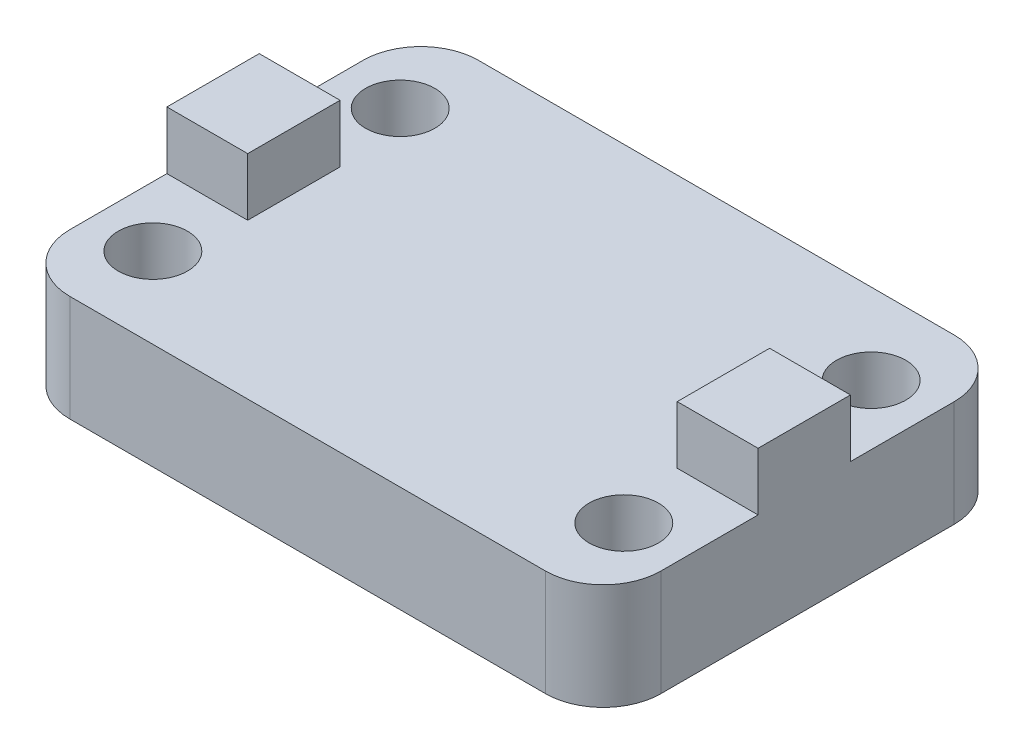
ISO-10303-21;
HEADER;
FILE_DESCRIPTION(('STEP AP214'),'2;1');
FILE_NAME('part.step','',(''),(''),'','','');
FILE_SCHEMA(('AUTOMOTIVE_DESIGN { 1 0 10303 214 1 1 1 1 }'));
ENDSEC;
DATA;
#1=APPLICATION_CONTEXT('core data for automotive mechanical design processes');
#2=APPLICATION_PROTOCOL_DEFINITION('international standard','automotive_design',2000,#1);
#3=PRODUCT_CONTEXT('',#1,'mechanical');
#4=PRODUCT('Part','Part','',(#3));
#5=PRODUCT_RELATED_PRODUCT_CATEGORY('part','',(#4));
#6=PRODUCT_DEFINITION_FORMATION('','',#4);
#7=PRODUCT_DEFINITION_CONTEXT('part definition',#1,'design');
#8=PRODUCT_DEFINITION('design','',#6,#7);
#9=PRODUCT_DEFINITION_SHAPE('','',#8);
#10=(LENGTH_UNIT() NAMED_UNIT(*) SI_UNIT(.MILLI.,.METRE.));
#11=(NAMED_UNIT(*) PLANE_ANGLE_UNIT() SI_UNIT($,.RADIAN.));
#12=(NAMED_UNIT(*) SI_UNIT($,.STERADIAN.) SOLID_ANGLE_UNIT());
#13=UNCERTAINTY_MEASURE_WITH_UNIT(LENGTH_MEASURE(1.E-05),#10,'distance_accuracy_value','');
#14=(GEOMETRIC_REPRESENTATION_CONTEXT(3) GLOBAL_UNCERTAINTY_ASSIGNED_CONTEXT((#13)) GLOBAL_UNIT_ASSIGNED_CONTEXT((#10,
#11,#12)) REPRESENTATION_CONTEXT('',''));
#15=CARTESIAN_POINT('',(0.,0.,0.));
#16=DIRECTION('',(0.,0.,1.));
#17=DIRECTION('',(1.,0.,0.));
#18=AXIS2_PLACEMENT_3D('',#15,#16,#17);
#19=CARTESIAN_POINT('',(0.,4.6,0.));
#20=DIRECTION('',(0.,-1.,0.));
#21=DIRECTION('',(0.,0.,-1.));
#22=AXIS2_PLACEMENT_3D('',#19,#20,#21);
#23=PLANE('',#22);
#24=CARTESIAN_POINT('',(2.60372599116189,4.6,-3.49460591128219));
#25=DIRECTION('',(0.,1.,0.));
#26=DIRECTION('',(0.,0.,1.));
#27=AXIS2_PLACEMENT_3D('',#24,#25,#26);
#28=CIRCLE('',#27,1.5);
#29=CARTESIAN_POINT('',(2.60372599116189,4.6,-1.99460591128219));
#30=VERTEX_POINT('',#29);
#31=EDGE_CURVE('E263',#30,#30,#28,.T.);
#32=ORIENTED_EDGE('',*,*,#31,.F.);
#33=EDGE_LOOP('',(#32));
#34=FACE_BOUND('',#33,.T.);
#35=CARTESIAN_POINT('',(2.60372599116189,4.6,-14.2053940887178));
#36=DIRECTION('',(0.,-1.,0.));
#37=DIRECTION('',(0.,0.,-1.));
#38=AXIS2_PLACEMENT_3D('',#35,#36,#37);
#39=CIRCLE('',#38,1.5);
#40=CARTESIAN_POINT('',(2.60372599116189,4.6,-15.7053940887178));
#41=VERTEX_POINT('',#40);
#42=EDGE_CURVE('E255',#41,#41,#39,.T.);
#43=ORIENTED_EDGE('',*,*,#42,.T.);
#44=EDGE_LOOP('',(#43));
#45=FACE_BOUND('',#44,.T.);
#46=CARTESIAN_POINT('',(22.9962740088381,4.6,-14.2053940887178));
#47=DIRECTION('',(0.,1.,0.));
#48=DIRECTION('',(0.,0.,-1.));
#49=AXIS2_PLACEMENT_3D('',#46,#47,#48);
#50=CIRCLE('',#49,1.5);
#51=CARTESIAN_POINT('',(22.9962740088381,4.6,-15.7053940887178));
#52=VERTEX_POINT('',#51);
#53=EDGE_CURVE('E247',#52,#52,#50,.T.);
#54=ORIENTED_EDGE('',*,*,#53,.F.);
#55=EDGE_LOOP('',(#54));
#56=FACE_BOUND('',#55,.T.);
#57=CARTESIAN_POINT('',(22.9962740088381,4.6,-3.49460591128219));
#58=DIRECTION('',(0.,-1.,0.));
#59=DIRECTION('',(0.,0.,1.));
#60=AXIS2_PLACEMENT_3D('',#57,#58,#59);
#61=CIRCLE('',#60,1.5);
#62=CARTESIAN_POINT('',(22.9962740088381,4.6,-1.99460591128219));
#63=VERTEX_POINT('',#62);
#64=EDGE_CURVE('E242',#63,#63,#61,.T.);
#65=ORIENTED_EDGE('',*,*,#64,.T.);
#66=EDGE_LOOP('',(#65));
#67=FACE_BOUND('',#66,.T.);
#68=DIRECTION('',(0.,0.,-1.));
#69=VECTOR('',#68,1.);
#70=CARTESIAN_POINT('',(22.1,4.6,-10.7053940887178));
#71=LINE('',#70,#69);
#72=CARTESIAN_POINT('',(22.1,4.6,-6.70539408871781));
#73=VERTEX_POINT('',#72);
#74=CARTESIAN_POINT('',(22.1,4.6,-10.7053940887178));
#75=VERTEX_POINT('',#74);
#76=EDGE_CURVE('E192',#73,#75,#71,.T.);
#77=ORIENTED_EDGE('',*,*,#76,.T.);
#78=DIRECTION('',(1.,0.,0.));
#79=VECTOR('',#78,1.);
#80=CARTESIAN_POINT('',(25.6,4.6,-10.7053940887178));
#81=LINE('',#80,#79);
#82=CARTESIAN_POINT('',(25.6,4.6,-10.7053940887178));
#83=VERTEX_POINT('',#82);
#84=EDGE_CURVE('E189',#75,#83,#81,.T.);
#85=ORIENTED_EDGE('',*,*,#84,.T.);
#86=DIRECTION('',(0.,0.,1.));
#87=VECTOR('',#86,1.);
#88=CARTESIAN_POINT('',(25.6,4.6,-17.7));
#89=LINE('',#88,#87);
#90=CARTESIAN_POINT('',(25.6,4.6,-15.2));
#91=VERTEX_POINT('',#90);
#92=EDGE_CURVE('E160',#91,#83,#89,.T.);
#93=ORIENTED_EDGE('',*,*,#92,.F.);
#94=CARTESIAN_POINT('',(23.1,4.6,-15.2));
#95=DIRECTION('',(0.,-1.,0.));
#96=DIRECTION('',(0.,0.,-1.));
#97=AXIS2_PLACEMENT_3D('',#94,#95,#96);
#98=CIRCLE('',#97,2.5);
#99=CARTESIAN_POINT('',(23.1,4.6,-17.7));
#100=VERTEX_POINT('',#99);
#101=EDGE_CURVE('E336',#91,#100,#98,.F.);
#102=ORIENTED_EDGE('',*,*,#101,.T.);
#103=DIRECTION('',(1.,0.,0.));
#104=VECTOR('',#103,1.);
#105=CARTESIAN_POINT('',(0.,4.6,-17.7));
#106=LINE('',#105,#104);
#107=CARTESIAN_POINT('',(2.5,4.6,-17.7));
#108=VERTEX_POINT('',#107);
#109=EDGE_CURVE('E275',#108,#100,#106,.T.);
#110=ORIENTED_EDGE('',*,*,#109,.F.);
#111=CARTESIAN_POINT('',(2.5,4.6,-15.2));
#112=DIRECTION('',(0.,-1.,0.));
#113=DIRECTION('',(0.,0.,-1.));
#114=AXIS2_PLACEMENT_3D('',#111,#112,#113);
#115=CIRCLE('',#114,2.5);
#116=CARTESIAN_POINT('',(0.,4.6,-15.2));
#117=VERTEX_POINT('',#116);
#118=EDGE_CURVE('E339',#108,#117,#115,.F.);
#119=ORIENTED_EDGE('',*,*,#118,.T.);
#120=DIRECTION('',(0.,0.,1.));
#121=VECTOR('',#120,1.);
#122=CARTESIAN_POINT('',(0.,4.6,-17.7));
#123=LINE('',#122,#121);
#124=CARTESIAN_POINT('',(0.,4.6,-10.7053940887178));
#125=VERTEX_POINT('',#124);
#126=EDGE_CURVE('E288',#117,#125,#123,.T.);
#127=ORIENTED_EDGE('',*,*,#126,.T.);
#128=DIRECTION('',(-1.,0.,0.));
#129=VECTOR('',#128,1.);
#130=CARTESIAN_POINT('',(0.,4.6,-10.7053940887178));
#131=LINE('',#130,#129);
#132=CARTESIAN_POINT('',(3.5,4.6,-10.7053940887178));
#133=VERTEX_POINT('',#132);
#134=EDGE_CURVE('E64',#133,#125,#131,.T.);
#135=ORIENTED_EDGE('',*,*,#134,.F.);
#136=DIRECTION('',(0.,0.,-1.));
#137=VECTOR('',#136,1.);
#138=CARTESIAN_POINT('',(3.5,4.6,-10.7053940887178));
#139=LINE('',#138,#137);
#140=CARTESIAN_POINT('',(3.5,4.6,-6.70539408871781));
#141=VERTEX_POINT('',#140);
#142=EDGE_CURVE('E222',#141,#133,#139,.T.);
#143=ORIENTED_EDGE('',*,*,#142,.F.);
#144=DIRECTION('',(1.,0.,0.));
#145=VECTOR('',#144,1.);
#146=CARTESIAN_POINT('',(0.,4.6,-6.70539408871781));
#147=LINE('',#146,#145);
#148=CARTESIAN_POINT('',(0.,4.6,-6.70539408871781));
#149=VERTEX_POINT('',#148);
#150=EDGE_CURVE('E166',#149,#141,#147,.T.);
#151=ORIENTED_EDGE('',*,*,#150,.F.);
#152=CARTESIAN_POINT('',(0.,4.6,-2.5));
#153=VERTEX_POINT('',#152);
#154=EDGE_CURVE('E287',#149,#153,#123,.T.);
#155=ORIENTED_EDGE('',*,*,#154,.T.);
#156=CARTESIAN_POINT('',(2.5,4.6,-2.5));
#157=DIRECTION('',(0.,-1.,0.));
#158=DIRECTION('',(0.,0.,-1.));
#159=AXIS2_PLACEMENT_3D('',#156,#157,#158);
#160=CIRCLE('',#159,2.5);
#161=CARTESIAN_POINT('',(2.5,4.6,0.));
#162=VERTEX_POINT('',#161);
#163=EDGE_CURVE('E342',#153,#162,#160,.F.);
#164=ORIENTED_EDGE('',*,*,#163,.T.);
#165=DIRECTION('',(1.,0.,0.));
#166=VECTOR('',#165,1.);
#167=CARTESIAN_POINT('',(0.,4.6,0.));
#168=LINE('',#167,#166);
#169=CARTESIAN_POINT('',(23.1,4.6,0.));
#170=VERTEX_POINT('',#169);
#171=EDGE_CURVE('E283',#162,#170,#168,.T.);
#172=ORIENTED_EDGE('',*,*,#171,.T.);
#173=CARTESIAN_POINT('',(23.1,4.6,-2.5));
#174=DIRECTION('',(0.,-1.,0.));
#175=DIRECTION('',(0.,0.,-1.));
#176=AXIS2_PLACEMENT_3D('',#173,#174,#175);
#177=CIRCLE('',#176,2.5);
#178=CARTESIAN_POINT('',(25.6,4.6,-2.5));
#179=VERTEX_POINT('',#178);
#180=EDGE_CURVE('E332',#170,#179,#177,.F.);
#181=ORIENTED_EDGE('',*,*,#180,.T.);
#182=CARTESIAN_POINT('',(25.6,4.6,-6.70539408871781));
#183=VERTEX_POINT('',#182);
#184=EDGE_CURVE('E279',#183,#179,#89,.T.);
#185=ORIENTED_EDGE('',*,*,#184,.F.);
#186=DIRECTION('',(-1.,0.,0.));
#187=VECTOR('',#186,1.);
#188=CARTESIAN_POINT('',(25.6,4.6,-6.70539408871781));
#189=LINE('',#188,#187);
#190=EDGE_CURVE('E56',#183,#73,#189,.T.);
#191=ORIENTED_EDGE('',*,*,#190,.T.);
#192=EDGE_LOOP('',(#77,#85,#93,#102,#110,#119,#127,#135,#143,#151,#155,#164,#172,#181,#185,#191));
#193=FACE_BOUND('',#192,.T.);
#194=ADVANCED_FACE('F40',(#34,#45,#56,#67,#193),#23,.F.);
#195=CARTESIAN_POINT('',(0.,4.6,-17.7));
#196=DIRECTION('',(0.,0.,-1.));
#197=DIRECTION('',(-1.,0.,0.));
#198=AXIS2_PLACEMENT_3D('',#195,#196,#197);
#199=PLANE('',#198);
#200=DIRECTION('',(1.,0.,0.));
#201=VECTOR('',#200,1.);
#202=CARTESIAN_POINT('',(0.,0.,-17.7));
#203=LINE('',#202,#201);
#204=CARTESIAN_POINT('',(2.5,0.,-17.7));
#205=VERTEX_POINT('',#204);
#206=CARTESIAN_POINT('',(23.1,0.,-17.7));
#207=VERTEX_POINT('',#206);
#208=EDGE_CURVE('E271',#205,#207,#203,.T.);
#209=ORIENTED_EDGE('',*,*,#208,.F.);
#210=DIRECTION('',(0.,-1.,0.));
#211=VECTOR('',#210,1.);
#212=CARTESIAN_POINT('',(2.5,4.6,-17.7));
#213=LINE('',#212,#211);
#214=EDGE_CURVE('E349',#205,#108,#213,.F.);
#215=ORIENTED_EDGE('',*,*,#214,.T.);
#216=ORIENTED_EDGE('',*,*,#109,.T.);
#217=DIRECTION('',(0.,-1.,0.));
#218=VECTOR('',#217,1.);
#219=CARTESIAN_POINT('',(23.1,4.6,-17.7));
#220=LINE('',#219,#218);
#221=EDGE_CURVE('E345',#100,#207,#220,.T.);
#222=ORIENTED_EDGE('',*,*,#221,.T.);
#223=EDGE_LOOP('',(#209,#215,#216,#222));
#224=FACE_BOUND('',#223,.T.);
#225=ADVANCED_FACE('F367',(#224),#199,.T.);
#226=CARTESIAN_POINT('',(0.,4.6,-17.7));
#227=DIRECTION('',(1.,0.,0.));
#228=DIRECTION('',(0.,0.,-1.));
#229=AXIS2_PLACEMENT_3D('',#226,#227,#228);
#230=PLANE('',#229);
#231=DIRECTION('',(0.,0.,1.));
#232=VECTOR('',#231,1.);
#233=CARTESIAN_POINT('',(0.,0.,-17.7));
#234=LINE('',#233,#232);
#235=CARTESIAN_POINT('',(0.,0.,-15.2));
#236=VERTEX_POINT('',#235);
#237=CARTESIAN_POINT('',(0.,0.,-2.5));
#238=VERTEX_POINT('',#237);
#239=EDGE_CURVE('E280',#236,#238,#234,.T.);
#240=ORIENTED_EDGE('',*,*,#239,.T.);
#241=DIRECTION('',(0.,-1.,0.));
#242=VECTOR('',#241,1.);
#243=CARTESIAN_POINT('',(0.,4.6,-2.5));
#244=LINE('',#243,#242);
#245=EDGE_CURVE('E328',#238,#153,#244,.F.);
#246=ORIENTED_EDGE('',*,*,#245,.T.);
#247=ORIENTED_EDGE('',*,*,#154,.F.);
#248=DIRECTION('',(0.,-1.,0.));
#249=VECTOR('',#248,1.);
#250=CARTESIAN_POINT('',(0.,7.1,-6.70539408871781));
#251=LINE('',#250,#249);
#252=CARTESIAN_POINT('',(0.,7.1,-6.70539408871781));
#253=VERTEX_POINT('',#252);
#254=EDGE_CURVE('E238',#253,#149,#251,.T.);
#255=ORIENTED_EDGE('',*,*,#254,.F.);
#256=DIRECTION('',(0.,0.,1.));
#257=VECTOR('',#256,1.);
#258=CARTESIAN_POINT('',(0.,7.1,-10.7053940887178));
#259=LINE('',#258,#257);
#260=CARTESIAN_POINT('',(0.,7.1,-10.7053940887178));
#261=VERTEX_POINT('',#260);
#262=EDGE_CURVE('E205',#261,#253,#259,.T.);
#263=ORIENTED_EDGE('',*,*,#262,.F.);
#264=DIRECTION('',(0.,-1.,0.));
#265=VECTOR('',#264,1.);
#266=CARTESIAN_POINT('',(0.,7.1,-10.7053940887178));
#267=LINE('',#266,#265);
#268=EDGE_CURVE('E218',#261,#125,#267,.T.);
#269=ORIENTED_EDGE('',*,*,#268,.T.);
#270=ORIENTED_EDGE('',*,*,#126,.F.);
#271=DIRECTION('',(0.,-1.,0.));
#272=VECTOR('',#271,1.);
#273=CARTESIAN_POINT('',(0.,0.,-15.2));
#274=LINE('',#273,#272);
#275=EDGE_CURVE('E324',#117,#236,#274,.T.);
#276=ORIENTED_EDGE('',*,*,#275,.T.);
#277=EDGE_LOOP('',(#240,#246,#247,#255,#263,#269,#270,#276));
#278=FACE_BOUND('',#277,.T.);
#279=ADVANCED_FACE('F377',(#278),#230,.F.);
#280=CARTESIAN_POINT('',(0.,4.6,0.));
#281=DIRECTION('',(0.,0.,-1.));
#282=DIRECTION('',(-1.,0.,0.));
#283=AXIS2_PLACEMENT_3D('',#280,#281,#282);
#284=PLANE('',#283);
#285=ORIENTED_EDGE('',*,*,#171,.F.);
#286=DIRECTION('',(0.,-1.,0.));
#287=VECTOR('',#286,1.);
#288=CARTESIAN_POINT('',(2.5,4.6,0.));
#289=LINE('',#288,#287);
#290=CARTESIAN_POINT('',(2.5,0.,0.));
#291=VERTEX_POINT('',#290);
#292=EDGE_CURVE('E308',#162,#291,#289,.T.);
#293=ORIENTED_EDGE('',*,*,#292,.T.);
#294=DIRECTION('',(1.,0.,0.));
#295=VECTOR('',#294,1.);
#296=CARTESIAN_POINT('',(0.,0.,0.));
#297=LINE('',#296,#295);
#298=CARTESIAN_POINT('',(23.1,0.,0.));
#299=VERTEX_POINT('',#298);
#300=EDGE_CURVE('E299',#291,#299,#297,.T.);
#301=ORIENTED_EDGE('',*,*,#300,.T.);
#302=DIRECTION('',(0.,-1.,0.));
#303=VECTOR('',#302,1.);
#304=CARTESIAN_POINT('',(23.1,4.6,0.));
#305=LINE('',#304,#303);
#306=EDGE_CURVE('E291',#299,#170,#305,.F.);
#307=ORIENTED_EDGE('',*,*,#306,.T.);
#308=EDGE_LOOP('',(#285,#293,#301,#307));
#309=FACE_BOUND('',#308,.T.);
#310=ADVANCED_FACE('F385',(#309),#284,.F.);
#311=CARTESIAN_POINT('',(25.6,4.6,-17.7));
#312=DIRECTION('',(1.,0.,0.));
#313=DIRECTION('',(0.,0.,-1.));
#314=AXIS2_PLACEMENT_3D('',#311,#312,#313);
#315=PLANE('',#314);
#316=DIRECTION('',(0.,0.,1.));
#317=VECTOR('',#316,1.);
#318=CARTESIAN_POINT('',(25.6,0.,-17.7));
#319=LINE('',#318,#317);
#320=CARTESIAN_POINT('',(25.6,0.,-15.2));
#321=VERTEX_POINT('',#320);
#322=CARTESIAN_POINT('',(25.6,0.,-2.5));
#323=VERTEX_POINT('',#322);
#324=EDGE_CURVE('E295',#321,#323,#319,.T.);
#325=ORIENTED_EDGE('',*,*,#324,.F.);
#326=DIRECTION('',(0.,-1.,0.));
#327=VECTOR('',#326,1.);
#328=CARTESIAN_POINT('',(25.6,4.6,-15.2));
#329=LINE('',#328,#327);
#330=EDGE_CURVE('E11',#321,#91,#329,.F.);
#331=ORIENTED_EDGE('',*,*,#330,.T.);
#332=ORIENTED_EDGE('',*,*,#92,.T.);
#333=DIRECTION('',(0.,-1.,0.));
#334=VECTOR('',#333,1.);
#335=CARTESIAN_POINT('',(25.6,7.1,-10.7053940887178));
#336=LINE('',#335,#334);
#337=CARTESIAN_POINT('',(25.6,7.1,-10.7053940887178));
#338=VERTEX_POINT('',#337);
#339=EDGE_CURVE('E153',#338,#83,#336,.T.);
#340=ORIENTED_EDGE('',*,*,#339,.F.);
#341=DIRECTION('',(0.,0.,1.));
#342=VECTOR('',#341,1.);
#343=CARTESIAN_POINT('',(25.6,7.1,-10.7053940887178));
#344=LINE('',#343,#342);
#345=CARTESIAN_POINT('',(25.6,7.1,-6.70539408871781));
#346=VERTEX_POINT('',#345);
#347=EDGE_CURVE('E157',#338,#346,#344,.T.);
#348=ORIENTED_EDGE('',*,*,#347,.T.);
#349=DIRECTION('',(0.,-1.,0.));
#350=VECTOR('',#349,1.);
#351=CARTESIAN_POINT('',(25.6,7.1,-6.70539408871781));
#352=LINE('',#351,#350);
#353=EDGE_CURVE('E188',#346,#183,#352,.T.);
#354=ORIENTED_EDGE('',*,*,#353,.T.);
#355=ORIENTED_EDGE('',*,*,#184,.T.);
#356=DIRECTION('',(0.,-1.,0.));
#357=VECTOR('',#356,1.);
#358=CARTESIAN_POINT('',(25.6,0.,-2.5));
#359=LINE('',#358,#357);
#360=EDGE_CURVE('E49',#179,#323,#359,.T.);
#361=ORIENTED_EDGE('',*,*,#360,.T.);
#362=EDGE_LOOP('',(#325,#331,#332,#340,#348,#354,#355,#361));
#363=FACE_BOUND('',#362,.T.);
#364=ADVANCED_FACE('F156',(#363),#315,.T.);
#365=CARTESIAN_POINT('',(0.,0.,0.));
#366=DIRECTION('',(0.,-1.,0.));
#367=DIRECTION('',(0.,0.,-1.));
#368=AXIS2_PLACEMENT_3D('',#365,#366,#367);
#369=PLANE('',#368);
#370=CARTESIAN_POINT('',(22.9962740088381,0.,-3.49460591128219));
#371=DIRECTION('',(0.,-1.,0.));
#372=DIRECTION('',(0.,0.,1.));
#373=AXIS2_PLACEMENT_3D('',#370,#371,#372);
#374=CIRCLE('',#373,1.5);
#375=CARTESIAN_POINT('',(22.9962740088381,0.,-1.99460591128219));
#376=VERTEX_POINT('',#375);
#377=EDGE_CURVE('E243',#376,#376,#374,.T.);
#378=ORIENTED_EDGE('',*,*,#377,.F.);
#379=EDGE_LOOP('',(#378));
#380=FACE_BOUND('',#379,.T.);
#381=CARTESIAN_POINT('',(22.9962740088381,0.,-14.2053940887178));
#382=DIRECTION('',(0.,1.,0.));
#383=DIRECTION('',(0.,0.,-1.));
#384=AXIS2_PLACEMENT_3D('',#381,#382,#383);
#385=CIRCLE('',#384,1.5);
#386=CARTESIAN_POINT('',(22.9962740088381,0.,-15.7053940887178));
#387=VERTEX_POINT('',#386);
#388=EDGE_CURVE('E251',#387,#387,#385,.T.);
#389=ORIENTED_EDGE('',*,*,#388,.T.);
#390=EDGE_LOOP('',(#389));
#391=FACE_BOUND('',#390,.T.);
#392=CARTESIAN_POINT('',(2.60372599116189,0.,-14.2053940887178));
#393=DIRECTION('',(0.,-1.,0.));
#394=DIRECTION('',(0.,0.,-1.));
#395=AXIS2_PLACEMENT_3D('',#392,#393,#394);
#396=CIRCLE('',#395,1.5);
#397=CARTESIAN_POINT('',(2.60372599116189,0.,-15.7053940887178));
#398=VERTEX_POINT('',#397);
#399=EDGE_CURVE('E259',#398,#398,#396,.T.);
#400=ORIENTED_EDGE('',*,*,#399,.F.);
#401=EDGE_LOOP('',(#400));
#402=FACE_BOUND('',#401,.T.);
#403=CARTESIAN_POINT('',(2.60372599116189,0.,-3.49460591128219));
#404=DIRECTION('',(0.,1.,0.));
#405=DIRECTION('',(0.,0.,1.));
#406=AXIS2_PLACEMENT_3D('',#403,#404,#405);
#407=CIRCLE('',#406,1.5);
#408=CARTESIAN_POINT('',(2.60372599116189,0.,-1.99460591128219));
#409=VERTEX_POINT('',#408);
#410=EDGE_CURVE('E267',#409,#409,#407,.T.);
#411=ORIENTED_EDGE('',*,*,#410,.T.);
#412=EDGE_LOOP('',(#411));
#413=FACE_BOUND('',#412,.T.);
#414=ORIENTED_EDGE('',*,*,#300,.F.);
#415=CARTESIAN_POINT('',(2.5,0.,-2.5));
#416=DIRECTION('',(0.,-1.,0.));
#417=DIRECTION('',(0.,0.,-1.));
#418=AXIS2_PLACEMENT_3D('',#415,#416,#417);
#419=CIRCLE('',#418,2.5);
#420=EDGE_CURVE('E321',#291,#238,#419,.T.);
#421=ORIENTED_EDGE('',*,*,#420,.T.);
#422=ORIENTED_EDGE('',*,*,#239,.F.);
#423=CARTESIAN_POINT('',(2.5,0.,-15.2));
#424=DIRECTION('',(0.,-1.,0.));
#425=DIRECTION('',(0.,0.,-1.));
#426=AXIS2_PLACEMENT_3D('',#423,#424,#425);
#427=CIRCLE('',#426,2.5);
#428=EDGE_CURVE('E318',#236,#205,#427,.T.);
#429=ORIENTED_EDGE('',*,*,#428,.T.);
#430=ORIENTED_EDGE('',*,*,#208,.T.);
#431=CARTESIAN_POINT('',(23.1,0.,-15.2));
#432=DIRECTION('',(0.,-1.,0.));
#433=DIRECTION('',(0.,0.,-1.));
#434=AXIS2_PLACEMENT_3D('',#431,#432,#433);
#435=CIRCLE('',#434,2.5);
#436=EDGE_CURVE('E315',#207,#321,#435,.T.);
#437=ORIENTED_EDGE('',*,*,#436,.T.);
#438=ORIENTED_EDGE('',*,*,#324,.T.);
#439=CARTESIAN_POINT('',(23.1,0.,-2.5));
#440=DIRECTION('',(0.,-1.,0.));
#441=DIRECTION('',(0.,0.,-1.));
#442=AXIS2_PLACEMENT_3D('',#439,#440,#441);
#443=CIRCLE('',#442,2.5);
#444=EDGE_CURVE('E312',#323,#299,#443,.T.);
#445=ORIENTED_EDGE('',*,*,#444,.T.);
#446=EDGE_LOOP('',(#414,#421,#422,#429,#430,#437,#438,#445));
#447=FACE_BOUND('',#446,.T.);
#448=ADVANCED_FACE('F360',(#380,#391,#402,#413,#447),#369,.T.);
#449=CARTESIAN_POINT('',(2.5,4.6,-2.5));
#450=DIRECTION('',(0.,-1.,0.));
#451=DIRECTION('',(0.,0.,-1.));
#452=AXIS2_PLACEMENT_3D('',#449,#450,#451);
#453=CYLINDRICAL_SURFACE('',#452,2.5);
#454=ORIENTED_EDGE('',*,*,#163,.F.);
#455=ORIENTED_EDGE('',*,*,#245,.F.);
#456=ORIENTED_EDGE('',*,*,#420,.F.);
#457=ORIENTED_EDGE('',*,*,#292,.F.);
#458=EDGE_LOOP('',(#454,#455,#456,#457));
#459=FACE_BOUND('',#458,.T.);
#460=ADVANCED_FACE('F382',(#459),#453,.T.);
#461=CARTESIAN_POINT('',(2.5,4.6,-15.2));
#462=DIRECTION('',(0.,1.,0.));
#463=DIRECTION('',(0.,0.,1.));
#464=AXIS2_PLACEMENT_3D('',#461,#462,#463);
#465=CYLINDRICAL_SURFACE('',#464,2.5);
#466=ORIENTED_EDGE('',*,*,#118,.F.);
#467=ORIENTED_EDGE('',*,*,#214,.F.);
#468=ORIENTED_EDGE('',*,*,#428,.F.);
#469=ORIENTED_EDGE('',*,*,#275,.F.);
#470=EDGE_LOOP('',(#466,#467,#468,#469));
#471=FACE_BOUND('',#470,.T.);
#472=ADVANCED_FACE('F374',(#471),#465,.T.);
#473=CARTESIAN_POINT('',(23.1,4.6,-15.2));
#474=DIRECTION('',(0.,-1.,0.));
#475=DIRECTION('',(0.,0.,-1.));
#476=AXIS2_PLACEMENT_3D('',#473,#474,#475);
#477=CYLINDRICAL_SURFACE('',#476,2.5);
#478=ORIENTED_EDGE('',*,*,#101,.F.);
#479=ORIENTED_EDGE('',*,*,#330,.F.);
#480=ORIENTED_EDGE('',*,*,#436,.F.);
#481=ORIENTED_EDGE('',*,*,#221,.F.);
#482=EDGE_LOOP('',(#478,#479,#480,#481));
#483=FACE_BOUND('',#482,.T.);
#484=ADVANCED_FACE('F365',(#483),#477,.T.);
#485=CARTESIAN_POINT('',(23.1,4.6,-2.5));
#486=DIRECTION('',(0.,1.,0.));
#487=DIRECTION('',(0.,0.,1.));
#488=AXIS2_PLACEMENT_3D('',#485,#486,#487);
#489=CYLINDRICAL_SURFACE('',#488,2.5);
#490=ORIENTED_EDGE('',*,*,#180,.F.);
#491=ORIENTED_EDGE('',*,*,#306,.F.);
#492=ORIENTED_EDGE('',*,*,#444,.F.);
#493=ORIENTED_EDGE('',*,*,#360,.F.);
#494=EDGE_LOOP('',(#490,#491,#492,#493));
#495=FACE_BOUND('',#494,.T.);
#496=ADVANCED_FACE('F42',(#495),#489,.T.);
#497=CARTESIAN_POINT('',(2.60372599116189,0.,-3.49460591128219));
#498=DIRECTION('',(0.,1.,0.));
#499=DIRECTION('',(0.,0.,1.));
#500=AXIS2_PLACEMENT_3D('',#497,#498,#499);
#501=CYLINDRICAL_SURFACE('',#500,1.5);
#502=ORIENTED_EDGE('',*,*,#410,.F.);
#503=EDGE_LOOP('',(#502));
#504=FACE_BOUND('',#503,.T.);
#505=ORIENTED_EDGE('',*,*,#31,.T.);
#506=EDGE_LOOP('',(#505));
#507=FACE_BOUND('',#506,.T.);
#508=ADVANCED_FACE('F388',(#504,#507),#501,.F.);
#509=CARTESIAN_POINT('',(2.60372599116189,0.,-14.2053940887178));
#510=DIRECTION('',(0.,1.,0.));
#511=DIRECTION('',(0.,0.,1.));
#512=AXIS2_PLACEMENT_3D('',#509,#510,#511);
#513=CYLINDRICAL_SURFACE('',#512,1.5);
#514=ORIENTED_EDGE('',*,*,#399,.T.);
#515=EDGE_LOOP('',(#514));
#516=FACE_BOUND('',#515,.T.);
#517=ORIENTED_EDGE('',*,*,#42,.F.);
#518=EDGE_LOOP('',(#517));
#519=FACE_BOUND('',#518,.T.);
#520=ADVANCED_FACE('F393',(#516,#519),#513,.F.);
#521=CARTESIAN_POINT('',(22.9962740088381,0.,-14.2053940887178));
#522=DIRECTION('',(0.,1.,0.));
#523=DIRECTION('',(0.,0.,1.));
#524=AXIS2_PLACEMENT_3D('',#521,#522,#523);
#525=CYLINDRICAL_SURFACE('',#524,1.5);
#526=ORIENTED_EDGE('',*,*,#388,.F.);
#527=EDGE_LOOP('',(#526));
#528=FACE_BOUND('',#527,.T.);
#529=ORIENTED_EDGE('',*,*,#53,.T.);
#530=EDGE_LOOP('',(#529));
#531=FACE_BOUND('',#530,.T.);
#532=ADVANCED_FACE('F446',(#528,#531),#525,.F.);
#533=CARTESIAN_POINT('',(22.9962740088381,0.,-3.49460591128219));
#534=DIRECTION('',(0.,1.,0.));
#535=DIRECTION('',(0.,0.,1.));
#536=AXIS2_PLACEMENT_3D('',#533,#534,#535);
#537=CYLINDRICAL_SURFACE('',#536,1.5);
#538=ORIENTED_EDGE('',*,*,#377,.T.);
#539=EDGE_LOOP('',(#538));
#540=FACE_BOUND('',#539,.T.);
#541=ORIENTED_EDGE('',*,*,#64,.F.);
#542=EDGE_LOOP('',(#541));
#543=FACE_BOUND('',#542,.T.);
#544=ADVANCED_FACE('F463',(#540,#543),#537,.F.);
#545=CARTESIAN_POINT('',(0.,7.1,-6.70539408871781));
#546=DIRECTION('',(0.,0.,-1.));
#547=DIRECTION('',(-1.,0.,0.));
#548=AXIS2_PLACEMENT_3D('',#545,#546,#547);
#549=PLANE('',#548);
#550=ORIENTED_EDGE('',*,*,#150,.T.);
#551=DIRECTION('',(0.,-1.,0.));
#552=VECTOR('',#551,1.);
#553=CARTESIAN_POINT('',(3.5,7.1,-6.70539408871781));
#554=LINE('',#553,#552);
#555=CARTESIAN_POINT('',(3.5,7.1,-6.70539408871781));
#556=VERTEX_POINT('',#555);
#557=EDGE_CURVE('E234',#556,#141,#554,.T.);
#558=ORIENTED_EDGE('',*,*,#557,.F.);
#559=DIRECTION('',(1.,0.,0.));
#560=VECTOR('',#559,1.);
#561=CARTESIAN_POINT('',(0.,7.1,-6.70539408871781));
#562=LINE('',#561,#560);
#563=EDGE_CURVE('E209',#253,#556,#562,.T.);
#564=ORIENTED_EDGE('',*,*,#563,.F.);
#565=ORIENTED_EDGE('',*,*,#254,.T.);
#566=EDGE_LOOP('',(#550,#558,#564,#565));
#567=FACE_BOUND('',#566,.T.);
#568=ADVANCED_FACE('F473',(#567),#549,.F.);
#569=CARTESIAN_POINT('',(3.5,7.1,-10.7053940887178));
#570=DIRECTION('',(-1.,0.,0.));
#571=DIRECTION('',(0.,0.,1.));
#572=AXIS2_PLACEMENT_3D('',#569,#570,#571);
#573=PLANE('',#572);
#574=ORIENTED_EDGE('',*,*,#142,.T.);
#575=DIRECTION('',(0.,-1.,0.));
#576=VECTOR('',#575,1.);
#577=CARTESIAN_POINT('',(3.5,7.1,-10.7053940887178));
#578=LINE('',#577,#576);
#579=CARTESIAN_POINT('',(3.5,7.1,-10.7053940887178));
#580=VERTEX_POINT('',#579);
#581=EDGE_CURVE('E230',#580,#133,#578,.T.);
#582=ORIENTED_EDGE('',*,*,#581,.F.);
#583=DIRECTION('',(0.,0.,-1.));
#584=VECTOR('',#583,1.);
#585=CARTESIAN_POINT('',(3.5,7.1,-10.7053940887178));
#586=LINE('',#585,#584);
#587=EDGE_CURVE('E212',#556,#580,#586,.T.);
#588=ORIENTED_EDGE('',*,*,#587,.F.);
#589=ORIENTED_EDGE('',*,*,#557,.T.);
#590=EDGE_LOOP('',(#574,#582,#588,#589));
#591=FACE_BOUND('',#590,.T.);
#592=ADVANCED_FACE('F491',(#591),#573,.F.);
#593=CARTESIAN_POINT('',(0.,7.1,-10.7053940887178));
#594=DIRECTION('',(0.,0.,1.));
#595=DIRECTION('',(1.,0.,0.));
#596=AXIS2_PLACEMENT_3D('',#593,#594,#595);
#597=PLANE('',#596);
#598=ORIENTED_EDGE('',*,*,#134,.T.);
#599=ORIENTED_EDGE('',*,*,#268,.F.);
#600=DIRECTION('',(-1.,0.,0.));
#601=VECTOR('',#600,1.);
#602=CARTESIAN_POINT('',(0.,7.1,-10.7053940887178));
#603=LINE('',#602,#601);
#604=EDGE_CURVE('E215',#580,#261,#603,.T.);
#605=ORIENTED_EDGE('',*,*,#604,.F.);
#606=ORIENTED_EDGE('',*,*,#581,.T.);
#607=EDGE_LOOP('',(#598,#599,#605,#606));
#608=FACE_BOUND('',#607,.T.);
#609=ADVANCED_FACE('F501',(#608),#597,.F.);
#610=CARTESIAN_POINT('',(0.,7.1,0.));
#611=DIRECTION('',(0.,1.,0.));
#612=DIRECTION('',(0.,0.,1.));
#613=AXIS2_PLACEMENT_3D('',#610,#611,#612);
#614=PLANE('',#613);
#615=ORIENTED_EDGE('',*,*,#262,.T.);
#616=ORIENTED_EDGE('',*,*,#563,.T.);
#617=ORIENTED_EDGE('',*,*,#587,.T.);
#618=ORIENTED_EDGE('',*,*,#604,.T.);
#619=EDGE_LOOP('',(#615,#616,#617,#618));
#620=FACE_BOUND('',#619,.T.);
#621=ADVANCED_FACE('F511',(#620),#614,.T.);
#622=CARTESIAN_POINT('',(25.6,7.1,-10.7053940887178));
#623=DIRECTION('',(0.,0.,-1.));
#624=DIRECTION('',(-1.,0.,0.));
#625=AXIS2_PLACEMENT_3D('',#622,#623,#624);
#626=PLANE('',#625);
#627=ORIENTED_EDGE('',*,*,#84,.F.);
#628=DIRECTION('',(0.,-1.,0.));
#629=VECTOR('',#628,1.);
#630=CARTESIAN_POINT('',(22.1,7.1,-10.7053940887178));
#631=LINE('',#630,#629);
#632=CARTESIAN_POINT('',(22.1,7.1,-10.7053940887178));
#633=VERTEX_POINT('',#632);
#634=EDGE_CURVE('E167',#633,#75,#631,.T.);
#635=ORIENTED_EDGE('',*,*,#634,.F.);
#636=DIRECTION('',(1.,0.,0.));
#637=VECTOR('',#636,1.);
#638=CARTESIAN_POINT('',(25.6,7.1,-10.7053940887178));
#639=LINE('',#638,#637);
#640=EDGE_CURVE('E173',#633,#338,#639,.T.);
#641=ORIENTED_EDGE('',*,*,#640,.T.);
#642=ORIENTED_EDGE('',*,*,#339,.T.);
#643=EDGE_LOOP('',(#627,#635,#641,#642));
#644=FACE_BOUND('',#643,.T.);
#645=ADVANCED_FACE('F179',(#644),#626,.T.);
#646=CARTESIAN_POINT('',(22.1,7.1,-10.7053940887178));
#647=DIRECTION('',(-1.,0.,0.));
#648=DIRECTION('',(0.,0.,1.));
#649=AXIS2_PLACEMENT_3D('',#646,#647,#648);
#650=PLANE('',#649);
#651=ORIENTED_EDGE('',*,*,#76,.F.);
#652=DIRECTION('',(0.,-1.,0.));
#653=VECTOR('',#652,1.);
#654=CARTESIAN_POINT('',(22.1,7.1,-6.70539408871781));
#655=LINE('',#654,#653);
#656=CARTESIAN_POINT('',(22.1,7.1,-6.70539408871781));
#657=VERTEX_POINT('',#656);
#658=EDGE_CURVE('E200',#657,#73,#655,.T.);
#659=ORIENTED_EDGE('',*,*,#658,.F.);
#660=DIRECTION('',(0.,0.,-1.));
#661=VECTOR('',#660,1.);
#662=CARTESIAN_POINT('',(22.1,7.1,-10.7053940887178));
#663=LINE('',#662,#661);
#664=EDGE_CURVE('E181',#657,#633,#663,.T.);
#665=ORIENTED_EDGE('',*,*,#664,.T.);
#666=ORIENTED_EDGE('',*,*,#634,.T.);
#667=EDGE_LOOP('',(#651,#659,#665,#666));
#668=FACE_BOUND('',#667,.T.);
#669=ADVANCED_FACE('F539',(#668),#650,.T.);
#670=CARTESIAN_POINT('',(25.6,7.1,-6.70539408871781));
#671=DIRECTION('',(0.,0.,1.));
#672=DIRECTION('',(1.,0.,0.));
#673=AXIS2_PLACEMENT_3D('',#670,#671,#672);
#674=PLANE('',#673);
#675=ORIENTED_EDGE('',*,*,#190,.F.);
#676=ORIENTED_EDGE('',*,*,#353,.F.);
#677=DIRECTION('',(-1.,0.,0.));
#678=VECTOR('',#677,1.);
#679=CARTESIAN_POINT('',(25.6,7.1,-6.70539408871781));
#680=LINE('',#679,#678);
#681=EDGE_CURVE('E176',#346,#657,#680,.T.);
#682=ORIENTED_EDGE('',*,*,#681,.T.);
#683=ORIENTED_EDGE('',*,*,#658,.T.);
#684=EDGE_LOOP('',(#675,#676,#682,#683));
#685=FACE_BOUND('',#684,.T.);
#686=ADVANCED_FACE('F548',(#685),#674,.T.);
#687=CARTESIAN_POINT('',(25.6,7.1,0.));
#688=DIRECTION('',(0.,1.,0.));
#689=DIRECTION('',(0.,0.,1.));
#690=AXIS2_PLACEMENT_3D('',#687,#688,#689);
#691=PLANE('',#690);
#692=ORIENTED_EDGE('',*,*,#347,.F.);
#693=ORIENTED_EDGE('',*,*,#640,.F.);
#694=ORIENTED_EDGE('',*,*,#664,.F.);
#695=ORIENTED_EDGE('',*,*,#681,.F.);
#696=EDGE_LOOP('',(#692,#693,#694,#695));
#697=FACE_BOUND('',#696,.T.);
#698=ADVANCED_FACE('F171',(#697),#691,.T.);
#699=CLOSED_SHELL('',(#194,#225,#279,#310,#364,#448,#460,#472,#484,#496,#508,#520,#532,#544,
#568,#592,#609,#621,#645,#669,#686,#698));
#700=MANIFOLD_SOLID_BREP('B2',#699);
#701=ADVANCED_BREP_SHAPE_REPRESENTATION('',(#18,#700),#14);
#702=SHAPE_DEFINITION_REPRESENTATION(#9,#701);
ENDSEC;
END-ISO-10303-21;
